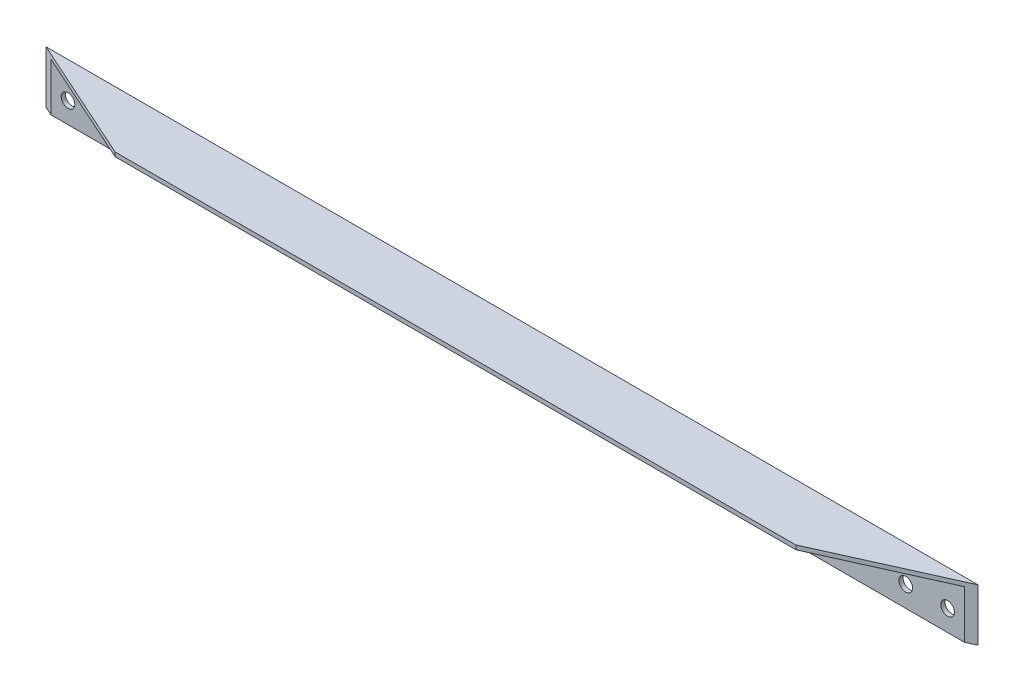
ISO-10303-21;
HEADER;
FILE_DESCRIPTION(('STEP AP214'),'2;1');
FILE_NAME('part.step','',(''),(''),'','','');
FILE_SCHEMA(('AUTOMOTIVE_DESIGN { 1 0 10303 214 1 1 1 1 }'));
ENDSEC;
DATA;
#1=APPLICATION_CONTEXT('core data for automotive mechanical design processes');
#2=APPLICATION_PROTOCOL_DEFINITION('international standard','automotive_design',2000,#1);
#3=PRODUCT_CONTEXT('',#1,'mechanical');
#4=PRODUCT('Part','Part','',(#3));
#5=PRODUCT_RELATED_PRODUCT_CATEGORY('part','',(#4));
#6=PRODUCT_DEFINITION_FORMATION('','',#4);
#7=PRODUCT_DEFINITION_CONTEXT('part definition',#1,'design');
#8=PRODUCT_DEFINITION('design','',#6,#7);
#9=PRODUCT_DEFINITION_SHAPE('','',#8);
#10=(LENGTH_UNIT() NAMED_UNIT(*) SI_UNIT(.MILLI.,.METRE.));
#11=(NAMED_UNIT(*) PLANE_ANGLE_UNIT() SI_UNIT($,.RADIAN.));
#12=(NAMED_UNIT(*) SI_UNIT($,.STERADIAN.) SOLID_ANGLE_UNIT());
#13=UNCERTAINTY_MEASURE_WITH_UNIT(LENGTH_MEASURE(1.E-05),#10,'distance_accuracy_value','');
#14=(GEOMETRIC_REPRESENTATION_CONTEXT(3) GLOBAL_UNCERTAINTY_ASSIGNED_CONTEXT((#13)) GLOBAL_UNIT_ASSIGNED_CONTEXT((#10,
#11,#12)) REPRESENTATION_CONTEXT('',''));
#15=CARTESIAN_POINT('',(0.,0.,0.));
#16=DIRECTION('',(0.,0.,1.));
#17=DIRECTION('',(1.,0.,0.));
#18=AXIS2_PLACEMENT_3D('',#15,#16,#17);
#19=CARTESIAN_POINT('',(-890.,100.,8.));
#20=DIRECTION('',(0.,0.,-1.));
#21=DIRECTION('',(-1.,0.,0.));
#22=AXIS2_PLACEMENT_3D('',#19,#20,#21);
#23=PLANE('',#22);
#24=CARTESIAN_POINT('',(-760.,39.9999999999999,8.));
#25=DIRECTION('',(0.,0.,1.));
#26=DIRECTION('',(-1.,0.,0.));
#27=AXIS2_PLACEMENT_3D('',#24,#25,#26);
#28=CIRCLE('',#27,12.9999999999998);
#29=CARTESIAN_POINT('',(-773.,39.9999999999999,8.));
#30=VERTEX_POINT('',#29);
#31=EDGE_CURVE('E107',#30,#30,#28,.T.);
#32=ORIENTED_EDGE('',*,*,#31,.F.);
#33=EDGE_LOOP('',(#32));
#34=FACE_BOUND('',#33,.T.);
#35=CARTESIAN_POINT('',(760.,39.9999999999999,8.));
#36=DIRECTION('',(0.,0.,1.));
#37=DIRECTION('',(1.,0.,0.));
#38=AXIS2_PLACEMENT_3D('',#35,#36,#37);
#39=CIRCLE('',#38,12.9999999999998);
#40=CARTESIAN_POINT('',(773.,39.9999999999999,8.));
#41=VERTEX_POINT('',#40);
#42=EDGE_CURVE('E122',#41,#41,#39,.T.);
#43=ORIENTED_EDGE('',*,*,#42,.F.);
#44=EDGE_LOOP('',(#43));
#45=FACE_BOUND('',#44,.T.);
#46=CARTESIAN_POINT('',(840.,39.9999999999999,8.));
#47=DIRECTION('',(0.,0.,1.));
#48=DIRECTION('',(1.,0.,0.));
#49=AXIS2_PLACEMENT_3D('',#46,#47,#48);
#50=CIRCLE('',#49,12.9999999999998);
#51=CARTESIAN_POINT('',(853.,39.9999999999999,8.));
#52=VERTEX_POINT('',#51);
#53=EDGE_CURVE('E128',#52,#52,#50,.T.);
#54=ORIENTED_EDGE('',*,*,#53,.F.);
#55=EDGE_LOOP('',(#54));
#56=FACE_BOUND('',#55,.T.);
#57=CARTESIAN_POINT('',(-840.,39.9999999999999,8.));
#58=DIRECTION('',(0.,0.,1.));
#59=DIRECTION('',(-1.,0.,0.));
#60=AXIS2_PLACEMENT_3D('',#57,#58,#59);
#61=CIRCLE('',#60,12.9999999999998);
#62=CARTESIAN_POINT('',(-853.,39.9999999999999,8.));
#63=VERTEX_POINT('',#62);
#64=EDGE_CURVE('E116',#63,#63,#61,.T.);
#65=ORIENTED_EDGE('',*,*,#64,.F.);
#66=EDGE_LOOP('',(#65));
#67=FACE_BOUND('',#66,.T.);
#68=DIRECTION('',(1.,0.,0.));
#69=VECTOR('',#68,1.);
#70=CARTESIAN_POINT('',(-890.,92.,8.));
#71=LINE('',#70,#69);
#72=CARTESIAN_POINT('',(-872.222222222222,92.,8.));
#73=VERTEX_POINT('',#72);
#74=CARTESIAN_POINT('',(872.222222222222,92.,8.));
#75=VERTEX_POINT('',#74);
#76=EDGE_CURVE('E39',#73,#75,#71,.T.);
#77=ORIENTED_EDGE('',*,*,#76,.F.);
#78=DIRECTION('',(0.,-1.,0.));
#79=VECTOR('',#78,1.);
#80=CARTESIAN_POINT('',(-872.222222222222,100.,8.));
#81=LINE('',#80,#79);
#82=CARTESIAN_POINT('',(-872.222222222222,0.,8.));
#83=VERTEX_POINT('',#82);
#84=EDGE_CURVE('E167',#73,#83,#81,.T.);
#85=ORIENTED_EDGE('',*,*,#84,.T.);
#86=DIRECTION('',(1.,0.,0.));
#87=VECTOR('',#86,1.);
#88=CARTESIAN_POINT('',(-890.,0.,8.));
#89=LINE('',#88,#87);
#90=CARTESIAN_POINT('',(872.222222222222,0.,8.));
#91=VERTEX_POINT('',#90);
#92=EDGE_CURVE('E134',#83,#91,#89,.T.);
#93=ORIENTED_EDGE('',*,*,#92,.T.);
#94=DIRECTION('',(0.,1.,0.));
#95=VECTOR('',#94,1.);
#96=CARTESIAN_POINT('',(872.222222222222,100.,8.));
#97=LINE('',#96,#95);
#98=EDGE_CURVE('E152',#91,#75,#97,.T.);
#99=ORIENTED_EDGE('',*,*,#98,.T.);
#100=EDGE_LOOP('',(#77,#85,#93,#99));
#101=FACE_BOUND('',#100,.T.);
#102=ADVANCED_FACE('F35',(#34,#45,#56,#67,#101),#23,.F.);
#103=CARTESIAN_POINT('',(-890.,100.,0.));
#104=DIRECTION('',(0.,0.,-1.));
#105=DIRECTION('',(-1.,0.,0.));
#106=AXIS2_PLACEMENT_3D('',#103,#104,#105);
#107=PLANE('',#106);
#108=CARTESIAN_POINT('',(-840.,39.9999999999999,0.));
#109=DIRECTION('',(0.,0.,1.));
#110=DIRECTION('',(-1.,0.,0.));
#111=AXIS2_PLACEMENT_3D('',#108,#109,#110);
#112=CIRCLE('',#111,12.9999999999998);
#113=CARTESIAN_POINT('',(-853.,39.9999999999999,0.));
#114=VERTEX_POINT('',#113);
#115=EDGE_CURVE('E114',#114,#114,#112,.T.);
#116=ORIENTED_EDGE('',*,*,#115,.T.);
#117=EDGE_LOOP('',(#116));
#118=FACE_BOUND('',#117,.T.);
#119=CARTESIAN_POINT('',(840.,39.9999999999999,0.));
#120=DIRECTION('',(0.,0.,1.));
#121=DIRECTION('',(1.,0.,0.));
#122=AXIS2_PLACEMENT_3D('',#119,#120,#121);
#123=CIRCLE('',#122,12.9999999999998);
#124=CARTESIAN_POINT('',(853.,39.9999999999999,0.));
#125=VERTEX_POINT('',#124);
#126=EDGE_CURVE('E125',#125,#125,#123,.T.);
#127=ORIENTED_EDGE('',*,*,#126,.T.);
#128=EDGE_LOOP('',(#127));
#129=FACE_BOUND('',#128,.T.);
#130=DIRECTION('',(0.,-1.,0.));
#131=VECTOR('',#130,1.);
#132=CARTESIAN_POINT('',(-890.,0.,0.));
#133=LINE('',#132,#131);
#134=CARTESIAN_POINT('',(-890.,100.,0.));
#135=VERTEX_POINT('',#134);
#136=CARTESIAN_POINT('',(-890.,0.,0.));
#137=VERTEX_POINT('',#136);
#138=EDGE_CURVE('E131',#135,#137,#133,.T.);
#139=ORIENTED_EDGE('',*,*,#138,.F.);
#140=DIRECTION('',(-1.,0.,0.));
#141=VECTOR('',#140,1.);
#142=CARTESIAN_POINT('',(-890.,100.,0.));
#143=LINE('',#142,#141);
#144=CARTESIAN_POINT('',(890.,100.,0.));
#145=VERTEX_POINT('',#144);
#146=EDGE_CURVE('E99',#145,#135,#143,.T.);
#147=ORIENTED_EDGE('',*,*,#146,.F.);
#148=DIRECTION('',(0.,1.,0.));
#149=VECTOR('',#148,1.);
#150=CARTESIAN_POINT('',(890.,0.,0.));
#151=LINE('',#150,#149);
#152=CARTESIAN_POINT('',(890.,0.,0.));
#153=VERTEX_POINT('',#152);
#154=EDGE_CURVE('E140',#153,#145,#151,.T.);
#155=ORIENTED_EDGE('',*,*,#154,.F.);
#156=DIRECTION('',(1.,0.,0.));
#157=VECTOR('',#156,1.);
#158=CARTESIAN_POINT('',(-890.,0.,0.));
#159=LINE('',#158,#157);
#160=EDGE_CURVE('E137',#137,#153,#159,.T.);
#161=ORIENTED_EDGE('',*,*,#160,.F.);
#162=EDGE_LOOP('',(#139,#147,#155,#161));
#163=FACE_BOUND('',#162,.T.);
#164=CARTESIAN_POINT('',(760.,39.9999999999999,0.));
#165=DIRECTION('',(0.,0.,1.));
#166=DIRECTION('',(1.,0.,0.));
#167=AXIS2_PLACEMENT_3D('',#164,#165,#166);
#168=CIRCLE('',#167,12.9999999999998);
#169=CARTESIAN_POINT('',(773.,39.9999999999999,0.));
#170=VERTEX_POINT('',#169);
#171=EDGE_CURVE('E119',#170,#170,#168,.T.);
#172=ORIENTED_EDGE('',*,*,#171,.T.);
#173=EDGE_LOOP('',(#172));
#174=FACE_BOUND('',#173,.T.);
#175=CARTESIAN_POINT('',(-760.,39.9999999999999,0.));
#176=DIRECTION('',(0.,0.,1.));
#177=DIRECTION('',(-1.,0.,0.));
#178=AXIS2_PLACEMENT_3D('',#175,#176,#177);
#179=CIRCLE('',#178,12.9999999999998);
#180=CARTESIAN_POINT('',(-773.,39.9999999999999,0.));
#181=VERTEX_POINT('',#180);
#182=EDGE_CURVE('E103',#181,#181,#179,.T.);
#183=ORIENTED_EDGE('',*,*,#182,.T.);
#184=EDGE_LOOP('',(#183));
#185=FACE_BOUND('',#184,.T.);
#186=ADVANCED_FACE('F171',(#118,#129,#163,#174,#185),#107,.T.);
#187=CARTESIAN_POINT('',(-890.,0.,8.));
#188=DIRECTION('',(0.,1.,0.));
#189=DIRECTION('',(0.,0.,1.));
#190=AXIS2_PLACEMENT_3D('',#187,#188,#189);
#191=PLANE('',#190);
#192=ORIENTED_EDGE('',*,*,#92,.F.);
#193=DIRECTION('',(-0.911921505175107,0.,-0.410364677328798));
#194=VECTOR('',#193,1.);
#195=CARTESIAN_POINT('',(-887.006237006237,0.,1.34719334719335));
#196=LINE('',#195,#194);
#197=EDGE_CURVE('E156',#83,#137,#196,.T.);
#198=ORIENTED_EDGE('',*,*,#197,.T.);
#199=ORIENTED_EDGE('',*,*,#160,.T.);
#200=DIRECTION('',(-0.911921505175107,0.,0.410364677328798));
#201=VECTOR('',#200,1.);
#202=CARTESIAN_POINT('',(-593.243243243243,0.,667.459459459459));
#203=LINE('',#202,#201);
#204=EDGE_CURVE('E154',#153,#91,#203,.T.);
#205=ORIENTED_EDGE('',*,*,#204,.T.);
#206=EDGE_LOOP('',(#192,#198,#199,#205));
#207=FACE_BOUND('',#206,.T.);
#208=ADVANCED_FACE('F37',(#207),#191,.F.);
#209=CARTESIAN_POINT('',(-890.,100.,8.));
#210=DIRECTION('',(0.,-1.,0.));
#211=DIRECTION('',(0.,0.,-1.));
#212=AXIS2_PLACEMENT_3D('',#209,#210,#211);
#213=PLANE('',#212);
#214=ORIENTED_EDGE('',*,*,#146,.T.);
#215=DIRECTION('',(-0.911921505175107,0.,-0.410364677328798));
#216=VECTOR('',#215,1.);
#217=CARTESIAN_POINT('',(-650.,100.,108.));
#218=LINE('',#217,#216);
#219=CARTESIAN_POINT('',(-650.,100.,108.));
#220=VERTEX_POINT('',#219);
#221=EDGE_CURVE('E89',#220,#135,#218,.T.);
#222=ORIENTED_EDGE('',*,*,#221,.F.);
#223=DIRECTION('',(-1.,0.,0.));
#224=VECTOR('',#223,1.);
#225=CARTESIAN_POINT('',(-890.,100.,108.));
#226=LINE('',#225,#224);
#227=CARTESIAN_POINT('',(650.,100.,108.));
#228=VERTEX_POINT('',#227);
#229=EDGE_CURVE('E97',#228,#220,#226,.T.);
#230=ORIENTED_EDGE('',*,*,#229,.F.);
#231=DIRECTION('',(-0.911921505175107,0.,0.410364677328798));
#232=VECTOR('',#231,1.);
#233=CARTESIAN_POINT('',(650.,100.,108.));
#234=LINE('',#233,#232);
#235=EDGE_CURVE('E59',#145,#228,#234,.T.);
#236=ORIENTED_EDGE('',*,*,#235,.F.);
#237=EDGE_LOOP('',(#214,#222,#230,#236));
#238=FACE_BOUND('',#237,.T.);
#239=ADVANCED_FACE('F96',(#238),#213,.F.);
#240=CARTESIAN_POINT('',(840.,39.9999999999999,8.));
#241=DIRECTION('',(0.,0.,-1.));
#242=DIRECTION('',(-1.,0.,0.));
#243=AXIS2_PLACEMENT_3D('',#240,#241,#242);
#244=CYLINDRICAL_SURFACE('',#243,12.9999999999998);
#245=ORIENTED_EDGE('',*,*,#53,.T.);
#246=EDGE_LOOP('',(#245));
#247=FACE_BOUND('',#246,.T.);
#248=ORIENTED_EDGE('',*,*,#126,.F.);
#249=EDGE_LOOP('',(#248));
#250=FACE_BOUND('',#249,.T.);
#251=ADVANCED_FACE('F201',(#247,#250),#244,.F.);
#252=CARTESIAN_POINT('',(760.,39.9999999999999,8.));
#253=DIRECTION('',(0.,0.,-1.));
#254=DIRECTION('',(-1.,0.,0.));
#255=AXIS2_PLACEMENT_3D('',#252,#253,#254);
#256=CYLINDRICAL_SURFACE('',#255,12.9999999999998);
#257=ORIENTED_EDGE('',*,*,#42,.T.);
#258=EDGE_LOOP('',(#257));
#259=FACE_BOUND('',#258,.T.);
#260=ORIENTED_EDGE('',*,*,#171,.F.);
#261=EDGE_LOOP('',(#260));
#262=FACE_BOUND('',#261,.T.);
#263=ADVANCED_FACE('F190',(#259,#262),#256,.F.);
#264=CARTESIAN_POINT('',(-840.,39.9999999999999,8.));
#265=DIRECTION('',(0.,0.,-1.));
#266=DIRECTION('',(-1.,0.,0.));
#267=AXIS2_PLACEMENT_3D('',#264,#265,#266);
#268=CYLINDRICAL_SURFACE('',#267,12.9999999999998);
#269=ORIENTED_EDGE('',*,*,#64,.T.);
#270=EDGE_LOOP('',(#269));
#271=FACE_BOUND('',#270,.T.);
#272=ORIENTED_EDGE('',*,*,#115,.F.);
#273=EDGE_LOOP('',(#272));
#274=FACE_BOUND('',#273,.T.);
#275=ADVANCED_FACE('F182',(#271,#274),#268,.F.);
#276=CARTESIAN_POINT('',(-760.,39.9999999999999,8.));
#277=DIRECTION('',(0.,0.,-1.));
#278=DIRECTION('',(-1.,0.,0.));
#279=AXIS2_PLACEMENT_3D('',#276,#277,#278);
#280=CYLINDRICAL_SURFACE('',#279,12.9999999999998);
#281=ORIENTED_EDGE('',*,*,#31,.T.);
#282=EDGE_LOOP('',(#281));
#283=FACE_BOUND('',#282,.T.);
#284=ORIENTED_EDGE('',*,*,#182,.F.);
#285=EDGE_LOOP('',(#284));
#286=FACE_BOUND('',#285,.T.);
#287=ADVANCED_FACE('F180',(#283,#286),#280,.F.);
#288=CARTESIAN_POINT('',(-890.,92.,108.));
#289=DIRECTION('',(0.,1.,0.));
#290=DIRECTION('',(0.,0.,1.));
#291=AXIS2_PLACEMENT_3D('',#288,#289,#290);
#292=PLANE('',#291);
#293=DIRECTION('',(1.,0.,0.));
#294=VECTOR('',#293,1.);
#295=CARTESIAN_POINT('',(-890.,92.,108.));
#296=LINE('',#295,#294);
#297=CARTESIAN_POINT('',(-650.,92.,108.));
#298=VERTEX_POINT('',#297);
#299=CARTESIAN_POINT('',(650.,92.,108.));
#300=VERTEX_POINT('',#299);
#301=EDGE_CURVE('E104',#298,#300,#296,.T.);
#302=ORIENTED_EDGE('',*,*,#301,.F.);
#303=DIRECTION('',(-0.911921505175107,0.,-0.410364677328798));
#304=VECTOR('',#303,1.);
#305=CARTESIAN_POINT('',(-849.5841995842,92.,18.1871101871102));
#306=LINE('',#305,#304);
#307=EDGE_CURVE('E51',#298,#73,#306,.T.);
#308=ORIENTED_EDGE('',*,*,#307,.T.);
#309=ORIENTED_EDGE('',*,*,#76,.T.);
#310=DIRECTION('',(-0.911921505175107,0.,0.410364677328798));
#311=VECTOR('',#310,1.);
#312=CARTESIAN_POINT('',(-630.665280665281,92.,684.299376299376));
#313=LINE('',#312,#311);
#314=EDGE_CURVE('E147',#75,#300,#313,.T.);
#315=ORIENTED_EDGE('',*,*,#314,.T.);
#316=EDGE_LOOP('',(#302,#308,#309,#315));
#317=FACE_BOUND('',#316,.T.);
#318=ADVANCED_FACE('F150',(#317),#292,.F.);
#319=CARTESIAN_POINT('',(-890.,92.,108.));
#320=DIRECTION('',(0.,0.,1.));
#321=DIRECTION('',(1.,0.,0.));
#322=AXIS2_PLACEMENT_3D('',#319,#320,#321);
#323=PLANE('',#322);
#324=DIRECTION('',(0.,1.,0.));
#325=VECTOR('',#324,1.);
#326=CARTESIAN_POINT('',(-650.,92.,108.));
#327=LINE('',#326,#325);
#328=EDGE_CURVE('E11',#298,#220,#327,.T.);
#329=ORIENTED_EDGE('',*,*,#328,.F.);
#330=ORIENTED_EDGE('',*,*,#301,.T.);
#331=DIRECTION('',(0.,-1.,0.));
#332=VECTOR('',#331,1.);
#333=CARTESIAN_POINT('',(650.,92.,108.));
#334=LINE('',#333,#332);
#335=EDGE_CURVE('E45',#228,#300,#334,.T.);
#336=ORIENTED_EDGE('',*,*,#335,.F.);
#337=ORIENTED_EDGE('',*,*,#229,.T.);
#338=EDGE_LOOP('',(#329,#330,#336,#337));
#339=FACE_BOUND('',#338,.T.);
#340=ADVANCED_FACE('F102',(#339),#323,.T.);
#341=CARTESIAN_POINT('',(650.,-2.50000000007189E-05,108.));
#342=DIRECTION('',(-0.410364677328798,0.,-0.911921505175107));
#343=DIRECTION('',(-0.911921505175107,0.,0.410364677328798));
#344=AXIS2_PLACEMENT_3D('',#341,#342,#343);
#345=PLANE('',#344);
#346=ORIENTED_EDGE('',*,*,#154,.T.);
#347=ORIENTED_EDGE('',*,*,#235,.T.);
#348=ORIENTED_EDGE('',*,*,#335,.T.);
#349=ORIENTED_EDGE('',*,*,#314,.F.);
#350=ORIENTED_EDGE('',*,*,#98,.F.);
#351=ORIENTED_EDGE('',*,*,#204,.F.);
#352=EDGE_LOOP('',(#346,#347,#348,#349,#350,#351));
#353=FACE_BOUND('',#352,.T.);
#354=ADVANCED_FACE('F145',(#353),#345,.F.);
#355=CARTESIAN_POINT('',(-650.,-2.50000000007189E-05,108.));
#356=DIRECTION('',(0.410364677328798,0.,-0.911921505175107));
#357=DIRECTION('',(-0.911921505175107,0.,-0.410364677328798));
#358=AXIS2_PLACEMENT_3D('',#355,#356,#357);
#359=PLANE('',#358);
#360=ORIENTED_EDGE('',*,*,#84,.F.);
#361=ORIENTED_EDGE('',*,*,#307,.F.);
#362=ORIENTED_EDGE('',*,*,#328,.T.);
#363=ORIENTED_EDGE('',*,*,#221,.T.);
#364=ORIENTED_EDGE('',*,*,#138,.T.);
#365=ORIENTED_EDGE('',*,*,#197,.F.);
#366=EDGE_LOOP('',(#360,#361,#362,#363,#364,#365));
#367=FACE_BOUND('',#366,.T.);
#368=ADVANCED_FACE('F88',(#367),#359,.F.);
#369=CLOSED_SHELL('',(#102,#186,#208,#239,#251,#263,#275,#287,#318,#340,#354,#368));
#370=MANIFOLD_SOLID_BREP('B2',#369);
#371=ADVANCED_BREP_SHAPE_REPRESENTATION('',(#18,#370),#14);
#372=SHAPE_DEFINITION_REPRESENTATION(#9,#371);
ENDSEC;
END-ISO-10303-21;
